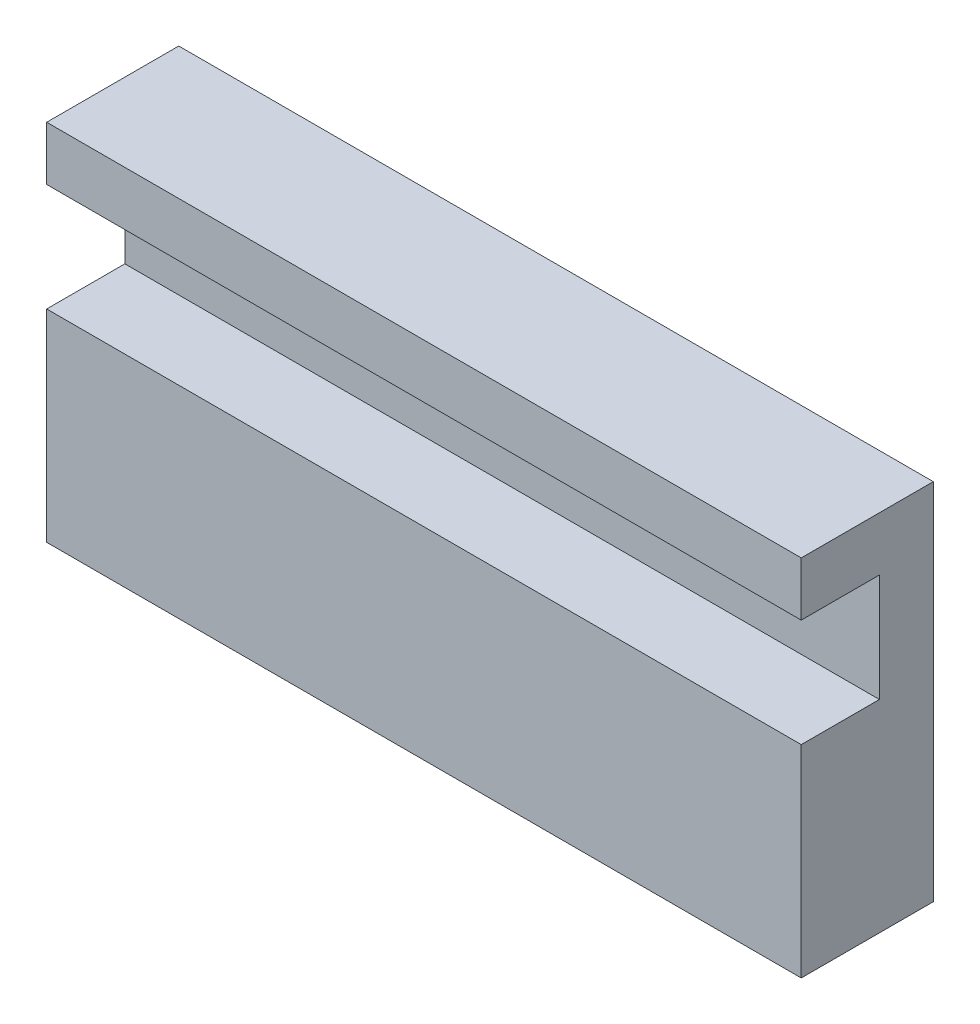
ISO-10303-21;
HEADER;
FILE_DESCRIPTION(('STEP AP214'),'2;1');
FILE_NAME('part.step','',(''),(''),'','','');
FILE_SCHEMA(('AUTOMOTIVE_DESIGN { 1 0 10303 214 1 1 1 1 }'));
ENDSEC;
DATA;
#1=APPLICATION_CONTEXT('core data for automotive mechanical design processes');
#2=APPLICATION_PROTOCOL_DEFINITION('international standard','automotive_design',2000,#1);
#3=PRODUCT_CONTEXT('',#1,'mechanical');
#4=PRODUCT('Part','Part','',(#3));
#5=PRODUCT_RELATED_PRODUCT_CATEGORY('part','',(#4));
#6=PRODUCT_DEFINITION_FORMATION('','',#4);
#7=PRODUCT_DEFINITION_CONTEXT('part definition',#1,'design');
#8=PRODUCT_DEFINITION('design','',#6,#7);
#9=PRODUCT_DEFINITION_SHAPE('','',#8);
#10=(LENGTH_UNIT() NAMED_UNIT(*) SI_UNIT(.MILLI.,.METRE.));
#11=(NAMED_UNIT(*) PLANE_ANGLE_UNIT() SI_UNIT($,.RADIAN.));
#12=(NAMED_UNIT(*) SI_UNIT($,.STERADIAN.) SOLID_ANGLE_UNIT());
#13=UNCERTAINTY_MEASURE_WITH_UNIT(LENGTH_MEASURE(1.E-05),#10,'distance_accuracy_value','');
#14=(GEOMETRIC_REPRESENTATION_CONTEXT(3) GLOBAL_UNCERTAINTY_ASSIGNED_CONTEXT((#13)) GLOBAL_UNIT_ASSIGNED_CONTEXT((#10,
#11,#12)) REPRESENTATION_CONTEXT('',''));
#15=CARTESIAN_POINT('',(0.,0.,0.));
#16=DIRECTION('',(0.,0.,1.));
#17=DIRECTION('',(1.,0.,0.));
#18=AXIS2_PLACEMENT_3D('',#15,#16,#17);
#19=CARTESIAN_POINT('',(0.,0.,4.9));
#20=DIRECTION('',(0.,0.,-1.));
#21=DIRECTION('',(-1.,0.,0.));
#22=AXIS2_PLACEMENT_3D('',#19,#20,#21);
#23=PLANE('',#22);
#24=DIRECTION('',(0.,1.,0.));
#25=VECTOR('',#24,1.);
#26=CARTESIAN_POINT('',(27.99800038,0.,4.9));
#27=LINE('',#26,#25);
#28=CARTESIAN_POINT('',(27.99800038,11.5,4.9));
#29=VERTEX_POINT('',#28);
#30=CARTESIAN_POINT('',(27.99800038,13.5,4.9));
#31=VERTEX_POINT('',#30);
#32=EDGE_CURVE('E159',#29,#31,#27,.T.);
#33=ORIENTED_EDGE('',*,*,#32,.T.);
#34=DIRECTION('',(1.,0.,0.));
#35=VECTOR('',#34,1.);
#36=CARTESIAN_POINT('',(0.,13.5,4.9));
#37=LINE('',#36,#35);
#38=CARTESIAN_POINT('',(0.,13.5,4.9));
#39=VERTEX_POINT('',#38);
#40=EDGE_CURVE('E148',#39,#31,#37,.T.);
#41=ORIENTED_EDGE('',*,*,#40,.F.);
#42=DIRECTION('',(0.,-1.,0.));
#43=VECTOR('',#42,1.);
#44=CARTESIAN_POINT('',(0.,0.,4.9));
#45=LINE('',#44,#43);
#46=CARTESIAN_POINT('',(0.,11.5,4.9));
#47=VERTEX_POINT('',#46);
#48=EDGE_CURVE('E156',#39,#47,#45,.T.);
#49=ORIENTED_EDGE('',*,*,#48,.T.);
#50=DIRECTION('',(1.,0.,0.));
#51=VECTOR('',#50,1.);
#52=CARTESIAN_POINT('',(0.,11.5,4.9));
#53=LINE('',#52,#51);
#54=EDGE_CURVE('E11',#47,#29,#53,.T.);
#55=ORIENTED_EDGE('',*,*,#54,.T.);
#56=EDGE_LOOP('',(#33,#41,#49,#55));
#57=FACE_BOUND('',#56,.T.);
#58=ADVANCED_FACE('F33',(#57),#23,.F.);
#59=CARTESIAN_POINT('',(0.,0.,4.9));
#60=DIRECTION('',(0.,1.,0.));
#61=DIRECTION('',(0.,0.,1.));
#62=AXIS2_PLACEMENT_3D('',#59,#60,#61);
#63=PLANE('',#62);
#64=DIRECTION('',(0.,0.,-1.));
#65=VECTOR('',#64,1.);
#66=CARTESIAN_POINT('',(5.90599649806869,0.,0.));
#67=LINE('',#66,#65);
#68=CARTESIAN_POINT('',(5.90599649806869,0.,4.50400026142594));
#69=VERTEX_POINT('',#68);
#70=CARTESIAN_POINT('',(5.90599649806869,0.,1.03600001335141));
#71=VERTEX_POINT('',#70);
#72=EDGE_CURVE('E224',#69,#71,#67,.T.);
#73=ORIENTED_EDGE('',*,*,#72,.T.);
#74=DIRECTION('',(-1.,0.,0.));
#75=VECTOR('',#74,1.);
#76=CARTESIAN_POINT('',(0.,0.,1.03600001335141));
#77=LINE('',#76,#75);
#78=CARTESIAN_POINT('',(2.49600088258636,0.,1.03600001335141));
#79=VERTEX_POINT('',#78);
#80=EDGE_CURVE('E261',#71,#79,#77,.T.);
#81=ORIENTED_EDGE('',*,*,#80,.T.);
#82=DIRECTION('',(0.,0.,-1.));
#83=VECTOR('',#82,1.);
#84=CARTESIAN_POINT('',(2.49600088258636,0.,0.));
#85=LINE('',#84,#83);
#86=CARTESIAN_POINT('',(2.49600088258636,0.,4.50400026142594));
#87=VERTEX_POINT('',#86);
#88=EDGE_CURVE('E274',#87,#79,#85,.T.);
#89=ORIENTED_EDGE('',*,*,#88,.F.);
#90=DIRECTION('',(-1.,0.,0.));
#91=VECTOR('',#90,1.);
#92=CARTESIAN_POINT('',(0.,0.,4.50400026142594));
#93=LINE('',#92,#91);
#94=EDGE_CURVE('E271',#69,#87,#93,.T.);
#95=ORIENTED_EDGE('',*,*,#94,.F.);
#96=EDGE_LOOP('',(#73,#81,#89,#95));
#97=FACE_BOUND('',#96,.T.);
#98=DIRECTION('',(1.,0.,0.));
#99=VECTOR('',#98,1.);
#100=CARTESIAN_POINT('',(0.,0.,0.));
#101=LINE('',#100,#99);
#102=CARTESIAN_POINT('',(0.,0.,0.));
#103=VERTEX_POINT('',#102);
#104=CARTESIAN_POINT('',(27.99800038,0.,0.));
#105=VERTEX_POINT('',#104);
#106=EDGE_CURVE('E179',#103,#105,#101,.T.);
#107=ORIENTED_EDGE('',*,*,#106,.T.);
#108=DIRECTION('',(0.,0.,-1.));
#109=VECTOR('',#108,1.);
#110=CARTESIAN_POINT('',(27.99800038,0.,4.9));
#111=LINE('',#110,#109);
#112=CARTESIAN_POINT('',(27.99800038,0.,4.9));
#113=VERTEX_POINT('',#112);
#114=EDGE_CURVE('E176',#113,#105,#111,.T.);
#115=ORIENTED_EDGE('',*,*,#114,.F.);
#116=DIRECTION('',(1.,0.,0.));
#117=VECTOR('',#116,1.);
#118=CARTESIAN_POINT('',(0.,0.,4.9));
#119=LINE('',#118,#117);
#120=CARTESIAN_POINT('',(0.,0.,4.9));
#121=VERTEX_POINT('',#120);
#122=EDGE_CURVE('E164',#121,#113,#119,.T.);
#123=ORIENTED_EDGE('',*,*,#122,.F.);
#124=DIRECTION('',(0.,0.,-1.));
#125=VECTOR('',#124,1.);
#126=CARTESIAN_POINT('',(0.,0.,4.9));
#127=LINE('',#126,#125);
#128=EDGE_CURVE('E186',#121,#103,#127,.T.);
#129=ORIENTED_EDGE('',*,*,#128,.T.);
#130=EDGE_LOOP('',(#107,#115,#123,#129));
#131=FACE_BOUND('',#130,.T.);
#132=DIRECTION('',(1.,0.,0.));
#133=VECTOR('',#132,1.);
#134=CARTESIAN_POINT('',(0.,0.,4.47800006344912));
#135=LINE('',#134,#133);
#136=CARTESIAN_POINT('',(20.6259978379811,0.,4.47800006344912));
#137=VERTEX_POINT('',#136);
#138=CARTESIAN_POINT('',(24.0339966978635,0.,4.47800006344912));
#139=VERTEX_POINT('',#138);
#140=EDGE_CURVE('E237',#137,#139,#135,.T.);
#141=ORIENTED_EDGE('',*,*,#140,.T.);
#142=DIRECTION('',(0.,0.,-1.));
#143=VECTOR('',#142,1.);
#144=CARTESIAN_POINT('',(24.0339966978635,0.,0.));
#145=LINE('',#144,#143);
#146=CARTESIAN_POINT('',(24.0339966978635,0.,1.06799990776924));
#147=VERTEX_POINT('',#146);
#148=EDGE_CURVE('E229',#139,#147,#145,.T.);
#149=ORIENTED_EDGE('',*,*,#148,.T.);
#150=DIRECTION('',(-1.,0.,0.));
#151=VECTOR('',#150,1.);
#152=CARTESIAN_POINT('',(0.,0.,1.06799990776923));
#153=LINE('',#152,#151);
#154=CARTESIAN_POINT('',(20.6259978379811,0.,1.06799990776923));
#155=VERTEX_POINT('',#154);
#156=EDGE_CURVE('E244',#147,#155,#153,.T.);
#157=ORIENTED_EDGE('',*,*,#156,.T.);
#158=DIRECTION('',(0.,0.,-1.));
#159=VECTOR('',#158,1.);
#160=CARTESIAN_POINT('',(20.6259978379811,0.,0.));
#161=LINE('',#160,#159);
#162=EDGE_CURVE('E240',#137,#155,#161,.T.);
#163=ORIENTED_EDGE('',*,*,#162,.F.);
#164=EDGE_LOOP('',(#141,#149,#157,#163));
#165=FACE_BOUND('',#164,.T.);
#166=ADVANCED_FACE('F198',(#97,#131,#165),#63,.F.);
#167=CARTESIAN_POINT('',(0.,0.,4.9));
#168=DIRECTION('',(1.,0.,0.));
#169=DIRECTION('',(0.,0.,-1.));
#170=AXIS2_PLACEMENT_3D('',#167,#168,#169);
#171=PLANE('',#170);
#172=ORIENTED_EDGE('',*,*,#48,.F.);
#173=DIRECTION('',(0.,0.,1.));
#174=VECTOR('',#173,1.);
#175=CARTESIAN_POINT('',(0.,13.5,4.9));
#176=LINE('',#175,#174);
#177=CARTESIAN_POINT('',(0.,13.5,0.));
#178=VERTEX_POINT('',#177);
#179=EDGE_CURVE('E145',#178,#39,#176,.T.);
#180=ORIENTED_EDGE('',*,*,#179,.F.);
#181=DIRECTION('',(0.,-1.,0.));
#182=VECTOR('',#181,1.);
#183=CARTESIAN_POINT('',(0.,0.,0.));
#184=LINE('',#183,#182);
#185=EDGE_CURVE('E177',#178,#103,#184,.T.);
#186=ORIENTED_EDGE('',*,*,#185,.T.);
#187=ORIENTED_EDGE('',*,*,#128,.F.);
#188=CARTESIAN_POINT('',(0.,7.5,4.9));
#189=VERTEX_POINT('',#188);
#190=EDGE_CURVE('E165',#189,#121,#45,.T.);
#191=ORIENTED_EDGE('',*,*,#190,.F.);
#192=DIRECTION('',(0.,0.,-1.));
#193=VECTOR('',#192,1.);
#194=CARTESIAN_POINT('',(0.,7.5,4.9));
#195=LINE('',#194,#193);
#196=CARTESIAN_POINT('',(0.,7.5,2.));
#197=VERTEX_POINT('',#196);
#198=EDGE_CURVE('E56',#189,#197,#195,.T.);
#199=ORIENTED_EDGE('',*,*,#198,.T.);
#200=DIRECTION('',(0.,1.,0.));
#201=VECTOR('',#200,1.);
#202=CARTESIAN_POINT('',(0.,0.,2.));
#203=LINE('',#202,#201);
#204=CARTESIAN_POINT('',(0.,11.5,2.));
#205=VERTEX_POINT('',#204);
#206=EDGE_CURVE('E222',#197,#205,#203,.T.);
#207=ORIENTED_EDGE('',*,*,#206,.T.);
#208=DIRECTION('',(0.,0.,1.));
#209=VECTOR('',#208,1.);
#210=CARTESIAN_POINT('',(0.,11.5,4.9));
#211=LINE('',#210,#209);
#212=EDGE_CURVE('E163',#205,#47,#211,.T.);
#213=ORIENTED_EDGE('',*,*,#212,.T.);
#214=EDGE_LOOP('',(#172,#180,#186,#187,#191,#199,#207,#213));
#215=FACE_BOUND('',#214,.T.);
#216=ADVANCED_FACE('F35',(#215),#171,.F.);
#217=CARTESIAN_POINT('',(27.99800038,0.,4.9));
#218=DIRECTION('',(-1.,0.,0.));
#219=DIRECTION('',(0.,0.,1.));
#220=AXIS2_PLACEMENT_3D('',#217,#218,#219);
#221=PLANE('',#220);
#222=DIRECTION('',(0.,1.,0.));
#223=VECTOR('',#222,1.);
#224=CARTESIAN_POINT('',(27.99800038,0.,0.));
#225=LINE('',#224,#223);
#226=CARTESIAN_POINT('',(27.99800038,13.5,0.));
#227=VERTEX_POINT('',#226);
#228=EDGE_CURVE('E168',#105,#227,#225,.T.);
#229=ORIENTED_EDGE('',*,*,#228,.T.);
#230=DIRECTION('',(0.,0.,-1.));
#231=VECTOR('',#230,1.);
#232=CARTESIAN_POINT('',(27.99800038,13.5,4.9));
#233=LINE('',#232,#231);
#234=EDGE_CURVE('E48',#31,#227,#233,.T.);
#235=ORIENTED_EDGE('',*,*,#234,.F.);
#236=ORIENTED_EDGE('',*,*,#32,.F.);
#237=DIRECTION('',(0.,0.,1.));
#238=VECTOR('',#237,1.);
#239=CARTESIAN_POINT('',(27.99800038,11.5,4.9));
#240=LINE('',#239,#238);
#241=CARTESIAN_POINT('',(27.99800038,11.5,2.));
#242=VERTEX_POINT('',#241);
#243=EDGE_CURVE('E210',#242,#29,#240,.T.);
#244=ORIENTED_EDGE('',*,*,#243,.F.);
#245=DIRECTION('',(0.,1.,0.));
#246=VECTOR('',#245,1.);
#247=CARTESIAN_POINT('',(27.99800038,7.5,2.));
#248=LINE('',#247,#246);
#249=CARTESIAN_POINT('',(27.99800038,7.5,2.));
#250=VERTEX_POINT('',#249);
#251=EDGE_CURVE('E208',#250,#242,#248,.T.);
#252=ORIENTED_EDGE('',*,*,#251,.F.);
#253=DIRECTION('',(0.,0.,-1.));
#254=VECTOR('',#253,1.);
#255=CARTESIAN_POINT('',(27.99800038,7.5,4.9));
#256=LINE('',#255,#254);
#257=CARTESIAN_POINT('',(27.99800038,7.5,4.9));
#258=VERTEX_POINT('',#257);
#259=EDGE_CURVE('E205',#258,#250,#256,.T.);
#260=ORIENTED_EDGE('',*,*,#259,.F.);
#261=EDGE_CURVE('E173',#113,#258,#27,.T.);
#262=ORIENTED_EDGE('',*,*,#261,.F.);
#263=ORIENTED_EDGE('',*,*,#114,.T.);
#264=EDGE_LOOP('',(#229,#235,#236,#244,#252,#260,#262,#263));
#265=FACE_BOUND('',#264,.T.);
#266=ADVANCED_FACE('F203',(#265),#221,.F.);
#267=ORIENTED_EDGE('',*,*,#261,.T.);
#268=DIRECTION('',(-1.,0.,0.));
#269=VECTOR('',#268,1.);
#270=CARTESIAN_POINT('',(0.,7.5,4.9));
#271=LINE('',#270,#269);
#272=EDGE_CURVE('E41',#258,#189,#271,.T.);
#273=ORIENTED_EDGE('',*,*,#272,.T.);
#274=ORIENTED_EDGE('',*,*,#190,.T.);
#275=ORIENTED_EDGE('',*,*,#122,.T.);
#276=EDGE_LOOP('',(#267,#273,#274,#275));
#277=FACE_BOUND('',#276,.T.);
#278=ADVANCED_FACE('F190',(#277),#23,.F.);
#279=CARTESIAN_POINT('',(0.,0.,0.));
#280=DIRECTION('',(0.,0.,-1.));
#281=DIRECTION('',(-1.,0.,0.));
#282=AXIS2_PLACEMENT_3D('',#279,#280,#281);
#283=PLANE('',#282);
#284=DIRECTION('',(-1.,0.,0.));
#285=VECTOR('',#284,1.);
#286=CARTESIAN_POINT('',(0.,13.5,0.));
#287=LINE('',#286,#285);
#288=EDGE_CURVE('E149',#227,#178,#287,.T.);
#289=ORIENTED_EDGE('',*,*,#288,.F.);
#290=ORIENTED_EDGE('',*,*,#228,.F.);
#291=ORIENTED_EDGE('',*,*,#106,.F.);
#292=ORIENTED_EDGE('',*,*,#185,.F.);
#293=EDGE_LOOP('',(#289,#290,#291,#292));
#294=FACE_BOUND('',#293,.T.);
#295=ADVANCED_FACE('F309',(#294),#283,.T.);
#296=CARTESIAN_POINT('',(5.90599649806869,5.5,0.));
#297=DIRECTION('',(-1.,0.,0.));
#298=DIRECTION('',(0.,0.,1.));
#299=AXIS2_PLACEMENT_3D('',#296,#297,#298);
#300=PLANE('',#299);
#301=ORIENTED_EDGE('',*,*,#72,.F.);
#302=DIRECTION('',(0.,-1.,0.));
#303=VECTOR('',#302,1.);
#304=CARTESIAN_POINT('',(5.90599649806869,5.5,4.50400026142594));
#305=LINE('',#304,#303);
#306=CARTESIAN_POINT('',(5.90599649806869,5.5,4.50400026142594));
#307=VERTEX_POINT('',#306);
#308=EDGE_CURVE('E170',#307,#69,#305,.T.);
#309=ORIENTED_EDGE('',*,*,#308,.F.);
#310=DIRECTION('',(0.,0.,-1.));
#311=VECTOR('',#310,1.);
#312=CARTESIAN_POINT('',(5.90599649806869,5.5,0.));
#313=LINE('',#312,#311);
#314=CARTESIAN_POINT('',(5.90599649806869,5.5,1.03600001335141));
#315=VERTEX_POINT('',#314);
#316=EDGE_CURVE('E257',#307,#315,#313,.T.);
#317=ORIENTED_EDGE('',*,*,#316,.T.);
#318=DIRECTION('',(0.,-1.,0.));
#319=VECTOR('',#318,1.);
#320=CARTESIAN_POINT('',(5.90599649806869,5.5,1.03600001335141));
#321=LINE('',#320,#319);
#322=EDGE_CURVE('E241',#315,#71,#321,.T.);
#323=ORIENTED_EDGE('',*,*,#322,.T.);
#324=EDGE_LOOP('',(#301,#309,#317,#323));
#325=FACE_BOUND('',#324,.T.);
#326=ADVANCED_FACE('F300',(#325),#300,.T.);
#327=CARTESIAN_POINT('',(0.,5.5,1.03600001335141));
#328=DIRECTION('',(0.,0.,1.));
#329=DIRECTION('',(1.,0.,0.));
#330=AXIS2_PLACEMENT_3D('',#327,#328,#329);
#331=PLANE('',#330);
#332=ORIENTED_EDGE('',*,*,#80,.F.);
#333=ORIENTED_EDGE('',*,*,#322,.F.);
#334=DIRECTION('',(-1.,0.,0.));
#335=VECTOR('',#334,1.);
#336=CARTESIAN_POINT('',(0.,5.5,1.03600001335141));
#337=LINE('',#336,#335);
#338=CARTESIAN_POINT('',(2.49600088258636,5.5,1.03600001335141));
#339=VERTEX_POINT('',#338);
#340=EDGE_CURVE('E267',#315,#339,#337,.T.);
#341=ORIENTED_EDGE('',*,*,#340,.T.);
#342=DIRECTION('',(0.,-1.,0.));
#343=VECTOR('',#342,1.);
#344=CARTESIAN_POINT('',(2.49600088258636,5.5,1.03600001335141));
#345=LINE('',#344,#343);
#346=EDGE_CURVE('E281',#339,#79,#345,.T.);
#347=ORIENTED_EDGE('',*,*,#346,.T.);
#348=EDGE_LOOP('',(#332,#333,#341,#347));
#349=FACE_BOUND('',#348,.T.);
#350=ADVANCED_FACE('F301',(#349),#331,.T.);
#351=CARTESIAN_POINT('',(2.49600088258636,5.5,0.));
#352=DIRECTION('',(-1.,0.,0.));
#353=DIRECTION('',(0.,0.,1.));
#354=AXIS2_PLACEMENT_3D('',#351,#352,#353);
#355=PLANE('',#354);
#356=ORIENTED_EDGE('',*,*,#88,.T.);
#357=ORIENTED_EDGE('',*,*,#346,.F.);
#358=DIRECTION('',(0.,0.,-1.));
#359=VECTOR('',#358,1.);
#360=CARTESIAN_POINT('',(2.49600088258636,5.5,0.));
#361=LINE('',#360,#359);
#362=CARTESIAN_POINT('',(2.49600088258636,5.5,4.50400026142594));
#363=VERTEX_POINT('',#362);
#364=EDGE_CURVE('E264',#363,#339,#361,.T.);
#365=ORIENTED_EDGE('',*,*,#364,.F.);
#366=DIRECTION('',(0.,-1.,0.));
#367=VECTOR('',#366,1.);
#368=CARTESIAN_POINT('',(2.49600088258636,5.5,4.50400026142594));
#369=LINE('',#368,#367);
#370=EDGE_CURVE('E282',#363,#87,#369,.T.);
#371=ORIENTED_EDGE('',*,*,#370,.T.);
#372=EDGE_LOOP('',(#356,#357,#365,#371));
#373=FACE_BOUND('',#372,.T.);
#374=ADVANCED_FACE('F295',(#373),#355,.F.);
#375=CARTESIAN_POINT('',(0.,5.5,4.50400026142594));
#376=DIRECTION('',(0.,0.,1.));
#377=DIRECTION('',(1.,0.,0.));
#378=AXIS2_PLACEMENT_3D('',#375,#376,#377);
#379=PLANE('',#378);
#380=ORIENTED_EDGE('',*,*,#94,.T.);
#381=ORIENTED_EDGE('',*,*,#370,.F.);
#382=DIRECTION('',(-1.,0.,0.));
#383=VECTOR('',#382,1.);
#384=CARTESIAN_POINT('',(0.,5.5,4.50400026142594));
#385=LINE('',#384,#383);
#386=EDGE_CURVE('E260',#307,#363,#385,.T.);
#387=ORIENTED_EDGE('',*,*,#386,.F.);
#388=ORIENTED_EDGE('',*,*,#308,.T.);
#389=EDGE_LOOP('',(#380,#381,#387,#388));
#390=FACE_BOUND('',#389,.T.);
#391=ADVANCED_FACE('F289',(#390),#379,.F.);
#392=CARTESIAN_POINT('',(0.,5.5,0.));
#393=DIRECTION('',(0.,-1.,0.));
#394=DIRECTION('',(0.,0.,-1.));
#395=AXIS2_PLACEMENT_3D('',#392,#393,#394);
#396=PLANE('',#395);
#397=ORIENTED_EDGE('',*,*,#316,.F.);
#398=ORIENTED_EDGE('',*,*,#386,.T.);
#399=ORIENTED_EDGE('',*,*,#364,.T.);
#400=ORIENTED_EDGE('',*,*,#340,.F.);
#401=EDGE_LOOP('',(#397,#398,#399,#400));
#402=FACE_BOUND('',#401,.T.);
#403=ADVANCED_FACE('F298',(#402),#396,.T.);
#404=CARTESIAN_POINT('',(0.,5.5,4.47800006344912));
#405=DIRECTION('',(0.,0.,-1.));
#406=DIRECTION('',(-1.,0.,0.));
#407=AXIS2_PLACEMENT_3D('',#404,#405,#406);
#408=PLANE('',#407);
#409=ORIENTED_EDGE('',*,*,#140,.F.);
#410=DIRECTION('',(0.,-1.,0.));
#411=VECTOR('',#410,1.);
#412=CARTESIAN_POINT('',(20.6259978379811,5.5,4.47800006344912));
#413=LINE('',#412,#411);
#414=CARTESIAN_POINT('',(20.6259978379811,5.5,4.47800006344912));
#415=VERTEX_POINT('',#414);
#416=EDGE_CURVE('E236',#415,#137,#413,.T.);
#417=ORIENTED_EDGE('',*,*,#416,.F.);
#418=DIRECTION('',(1.,0.,0.));
#419=VECTOR('',#418,1.);
#420=CARTESIAN_POINT('',(0.,5.5,4.47800006344912));
#421=LINE('',#420,#419);
#422=CARTESIAN_POINT('',(24.0339966978635,5.5,4.47800006344912));
#423=VERTEX_POINT('',#422);
#424=EDGE_CURVE('E225',#415,#423,#421,.T.);
#425=ORIENTED_EDGE('',*,*,#424,.T.);
#426=DIRECTION('',(0.,-1.,0.));
#427=VECTOR('',#426,1.);
#428=CARTESIAN_POINT('',(24.0339966978635,5.5,4.47800006344912));
#429=LINE('',#428,#427);
#430=EDGE_CURVE('E180',#423,#139,#429,.T.);
#431=ORIENTED_EDGE('',*,*,#430,.T.);
#432=EDGE_LOOP('',(#409,#417,#425,#431));
#433=FACE_BOUND('',#432,.T.);
#434=ADVANCED_FACE('F387',(#433),#408,.T.);
#435=CARTESIAN_POINT('',(24.0339966978635,5.5,0.));
#436=DIRECTION('',(-1.,0.,0.));
#437=DIRECTION('',(0.,0.,1.));
#438=AXIS2_PLACEMENT_3D('',#435,#436,#437);
#439=PLANE('',#438);
#440=ORIENTED_EDGE('',*,*,#148,.F.);
#441=ORIENTED_EDGE('',*,*,#430,.F.);
#442=DIRECTION('',(0.,0.,-1.));
#443=VECTOR('',#442,1.);
#444=CARTESIAN_POINT('',(24.0339966978635,5.5,0.));
#445=LINE('',#444,#443);
#446=CARTESIAN_POINT('',(24.0339966978635,5.5,1.06799990776924));
#447=VERTEX_POINT('',#446);
#448=EDGE_CURVE('E234',#423,#447,#445,.T.);
#449=ORIENTED_EDGE('',*,*,#448,.T.);
#450=DIRECTION('',(0.,-1.,0.));
#451=VECTOR('',#450,1.);
#452=CARTESIAN_POINT('',(24.0339966978635,5.5,1.06799990776924));
#453=LINE('',#452,#451);
#454=EDGE_CURVE('E251',#447,#147,#453,.T.);
#455=ORIENTED_EDGE('',*,*,#454,.T.);
#456=EDGE_LOOP('',(#440,#441,#449,#455));
#457=FACE_BOUND('',#456,.T.);
#458=ADVANCED_FACE('F395',(#457),#439,.T.);
#459=CARTESIAN_POINT('',(0.,5.5,1.06799990776923));
#460=DIRECTION('',(0.,0.,1.));
#461=DIRECTION('',(1.,0.,0.));
#462=AXIS2_PLACEMENT_3D('',#459,#460,#461);
#463=PLANE('',#462);
#464=ORIENTED_EDGE('',*,*,#156,.F.);
#465=ORIENTED_EDGE('',*,*,#454,.F.);
#466=DIRECTION('',(-1.,0.,0.));
#467=VECTOR('',#466,1.);
#468=CARTESIAN_POINT('',(0.,5.5,1.06799990776923));
#469=LINE('',#468,#467);
#470=CARTESIAN_POINT('',(20.6259978379811,5.5,1.06799990776923));
#471=VERTEX_POINT('',#470);
#472=EDGE_CURVE('E232',#447,#471,#469,.T.);
#473=ORIENTED_EDGE('',*,*,#472,.T.);
#474=DIRECTION('',(0.,-1.,0.));
#475=VECTOR('',#474,1.);
#476=CARTESIAN_POINT('',(20.6259978379811,5.5,1.06799990776923));
#477=LINE('',#476,#475);
#478=EDGE_CURVE('E253',#471,#155,#477,.T.);
#479=ORIENTED_EDGE('',*,*,#478,.T.);
#480=EDGE_LOOP('',(#464,#465,#473,#479));
#481=FACE_BOUND('',#480,.T.);
#482=ADVANCED_FACE('F405',(#481),#463,.T.);
#483=CARTESIAN_POINT('',(20.6259978379811,5.5,0.));
#484=DIRECTION('',(-1.,0.,0.));
#485=DIRECTION('',(0.,0.,1.));
#486=AXIS2_PLACEMENT_3D('',#483,#484,#485);
#487=PLANE('',#486);
#488=ORIENTED_EDGE('',*,*,#162,.T.);
#489=ORIENTED_EDGE('',*,*,#478,.F.);
#490=DIRECTION('',(0.,0.,-1.));
#491=VECTOR('',#490,1.);
#492=CARTESIAN_POINT('',(20.6259978379811,5.5,0.));
#493=LINE('',#492,#491);
#494=EDGE_CURVE('E228',#415,#471,#493,.T.);
#495=ORIENTED_EDGE('',*,*,#494,.F.);
#496=ORIENTED_EDGE('',*,*,#416,.T.);
#497=EDGE_LOOP('',(#488,#489,#495,#496));
#498=FACE_BOUND('',#497,.T.);
#499=ADVANCED_FACE('F415',(#498),#487,.F.);
#500=CARTESIAN_POINT('',(0.,5.5,0.));
#501=DIRECTION('',(0.,-1.,0.));
#502=DIRECTION('',(0.,0.,-1.));
#503=AXIS2_PLACEMENT_3D('',#500,#501,#502);
#504=PLANE('',#503);
#505=ORIENTED_EDGE('',*,*,#424,.F.);
#506=ORIENTED_EDGE('',*,*,#494,.T.);
#507=ORIENTED_EDGE('',*,*,#472,.F.);
#508=ORIENTED_EDGE('',*,*,#448,.F.);
#509=EDGE_LOOP('',(#505,#506,#507,#508));
#510=FACE_BOUND('',#509,.T.);
#511=ADVANCED_FACE('F424',(#510),#504,.T.);
#512=CARTESIAN_POINT('',(-2.50199962000001,7.5,2.));
#513=DIRECTION('',(0.,0.,-1.));
#514=DIRECTION('',(-1.,0.,0.));
#515=AXIS2_PLACEMENT_3D('',#512,#513,#514);
#516=PLANE('',#515);
#517=DIRECTION('',(1.,0.,0.));
#518=VECTOR('',#517,1.);
#519=CARTESIAN_POINT('',(-2.50199962000001,7.5,2.));
#520=LINE('',#519,#518);
#521=EDGE_CURVE('E216',#197,#250,#520,.T.);
#522=ORIENTED_EDGE('',*,*,#521,.T.);
#523=ORIENTED_EDGE('',*,*,#251,.T.);
#524=DIRECTION('',(1.,0.,0.));
#525=VECTOR('',#524,1.);
#526=CARTESIAN_POINT('',(-2.50199962000001,11.5,2.));
#527=LINE('',#526,#525);
#528=EDGE_CURVE('E217',#205,#242,#527,.T.);
#529=ORIENTED_EDGE('',*,*,#528,.F.);
#530=ORIENTED_EDGE('',*,*,#206,.F.);
#531=EDGE_LOOP('',(#522,#523,#529,#530));
#532=FACE_BOUND('',#531,.T.);
#533=ADVANCED_FACE('F433',(#532),#516,.F.);
#534=CARTESIAN_POINT('',(-2.50199962000001,11.5,4.9));
#535=DIRECTION('',(0.,1.,0.));
#536=DIRECTION('',(0.,0.,1.));
#537=AXIS2_PLACEMENT_3D('',#534,#535,#536);
#538=PLANE('',#537);
#539=ORIENTED_EDGE('',*,*,#528,.T.);
#540=ORIENTED_EDGE('',*,*,#243,.T.);
#541=ORIENTED_EDGE('',*,*,#54,.F.);
#542=ORIENTED_EDGE('',*,*,#212,.F.);
#543=EDGE_LOOP('',(#539,#540,#541,#542));
#544=FACE_BOUND('',#543,.T.);
#545=ADVANCED_FACE('F447',(#544),#538,.F.);
#546=CARTESIAN_POINT('',(-2.50199962000001,7.5,4.9));
#547=DIRECTION('',(0.,-1.,0.));
#548=DIRECTION('',(0.,0.,-1.));
#549=AXIS2_PLACEMENT_3D('',#546,#547,#548);
#550=PLANE('',#549);
#551=ORIENTED_EDGE('',*,*,#272,.F.);
#552=ORIENTED_EDGE('',*,*,#259,.T.);
#553=ORIENTED_EDGE('',*,*,#521,.F.);
#554=ORIENTED_EDGE('',*,*,#198,.F.);
#555=EDGE_LOOP('',(#551,#552,#553,#554));
#556=FACE_BOUND('',#555,.T.);
#557=ADVANCED_FACE('F454',(#556),#550,.F.);
#558=CARTESIAN_POINT('',(0.,13.5,0.));
#559=DIRECTION('',(0.,-1.,0.));
#560=DIRECTION('',(0.,0.,-1.));
#561=AXIS2_PLACEMENT_3D('',#558,#559,#560);
#562=PLANE('',#561);
#563=ORIENTED_EDGE('',*,*,#179,.T.);
#564=ORIENTED_EDGE('',*,*,#40,.T.);
#565=ORIENTED_EDGE('',*,*,#234,.T.);
#566=ORIENTED_EDGE('',*,*,#288,.T.);
#567=EDGE_LOOP('',(#563,#564,#565,#566));
#568=FACE_BOUND('',#567,.T.);
#569=ADVANCED_FACE('F147',(#568),#562,.F.);
#570=CLOSED_SHELL('',(#58,#166,#216,#266,#278,#295,#326,#350,#374,#391,#403,#434,#458,#482,#499,
#511,#533,#545,#557,#569));
#571=MANIFOLD_SOLID_BREP('B2',#570);
#572=ADVANCED_BREP_SHAPE_REPRESENTATION('',(#18,#571),#14);
#573=SHAPE_DEFINITION_REPRESENTATION(#9,#572);
ENDSEC;
END-ISO-10303-21;
